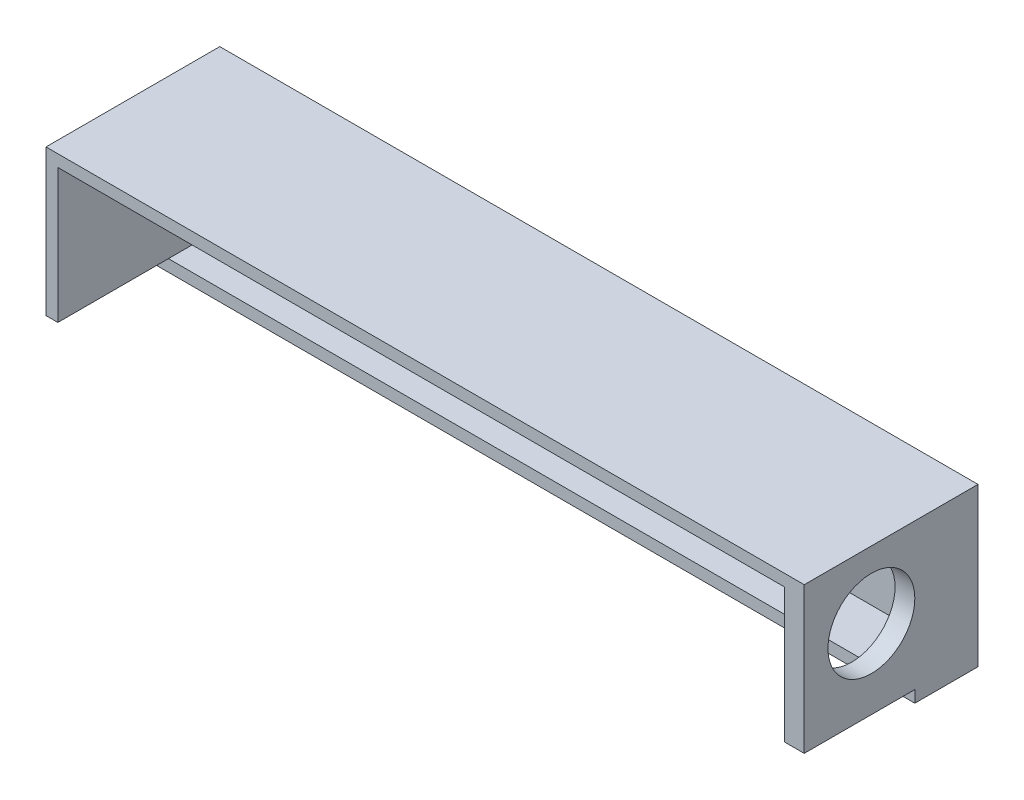
ISO-10303-21;
HEADER;
FILE_DESCRIPTION(('STEP AP214'),'2;1');
FILE_NAME('part.step','',(''),(''),'','','');
FILE_SCHEMA(('AUTOMOTIVE_DESIGN { 1 0 10303 214 1 1 1 1 }'));
ENDSEC;
DATA;
#1=APPLICATION_CONTEXT('core data for automotive mechanical design processes');
#2=APPLICATION_PROTOCOL_DEFINITION('international standard','automotive_design',2000,#1);
#3=PRODUCT_CONTEXT('',#1,'mechanical');
#4=PRODUCT('Part','Part','',(#3));
#5=PRODUCT_RELATED_PRODUCT_CATEGORY('part','',(#4));
#6=PRODUCT_DEFINITION_FORMATION('','',#4);
#7=PRODUCT_DEFINITION_CONTEXT('part definition',#1,'design');
#8=PRODUCT_DEFINITION('design','',#6,#7);
#9=PRODUCT_DEFINITION_SHAPE('','',#8);
#10=(LENGTH_UNIT() NAMED_UNIT(*) SI_UNIT(.MILLI.,.METRE.));
#11=(NAMED_UNIT(*) PLANE_ANGLE_UNIT() SI_UNIT($,.RADIAN.));
#12=(NAMED_UNIT(*) SI_UNIT($,.STERADIAN.) SOLID_ANGLE_UNIT());
#13=UNCERTAINTY_MEASURE_WITH_UNIT(LENGTH_MEASURE(1.E-05),#10,'distance_accuracy_value','');
#14=(GEOMETRIC_REPRESENTATION_CONTEXT(3) GLOBAL_UNCERTAINTY_ASSIGNED_CONTEXT((#13)) GLOBAL_UNIT_ASSIGNED_CONTEXT((#10,
#11,#12)) REPRESENTATION_CONTEXT('',''));
#15=CARTESIAN_POINT('',(0.,0.,0.));
#16=DIRECTION('',(0.,0.,1.));
#17=DIRECTION('',(1.,0.,0.));
#18=AXIS2_PLACEMENT_3D('',#15,#16,#17);
#19=CARTESIAN_POINT('',(46.5,-9.99999999999999,1.5));
#20=DIRECTION('',(0.,1.,0.));
#21=DIRECTION('',(-1.,0.,0.));
#22=AXIS2_PLACEMENT_3D('',#19,#20,#21);
#23=PLANE('',#22);
#24=DIRECTION('',(1.,0.,0.));
#25=VECTOR('',#24,1.);
#26=CARTESIAN_POINT('',(-55.,-9.99999999999999,8.));
#27=LINE('',#26,#25);
#28=CARTESIAN_POINT('',(-49.5,-9.99999999999999,8.));
#29=VERTEX_POINT('',#28);
#30=CARTESIAN_POINT('',(46.5,-9.99999999999999,8.));
#31=VERTEX_POINT('',#30);
#32=EDGE_CURVE('E130',#29,#31,#27,.T.);
#33=ORIENTED_EDGE('',*,*,#32,.F.);
#34=DIRECTION('',(0.,0.,1.));
#35=VECTOR('',#34,1.);
#36=CARTESIAN_POINT('',(-49.5,-9.99999999999999,8.));
#37=LINE('',#36,#35);
#38=CARTESIAN_POINT('',(-49.5,-9.99999999999999,0.));
#39=VERTEX_POINT('',#38);
#40=EDGE_CURVE('E148',#39,#29,#37,.T.);
#41=ORIENTED_EDGE('',*,*,#40,.F.);
#42=DIRECTION('',(1.,0.,0.));
#43=VECTOR('',#42,1.);
#44=CARTESIAN_POINT('',(46.5,-9.99999999999999,0.));
#45=LINE('',#44,#43);
#46=CARTESIAN_POINT('',(46.5,-9.99999999999999,0.));
#47=VERTEX_POINT('',#46);
#48=EDGE_CURVE('E192',#39,#47,#45,.T.);
#49=ORIENTED_EDGE('',*,*,#48,.T.);
#50=DIRECTION('',(0.,0.,-1.));
#51=VECTOR('',#50,1.);
#52=CARTESIAN_POINT('',(46.5,-9.99999999999999,1.5));
#53=LINE('',#52,#51);
#54=EDGE_CURVE('E202',#31,#47,#53,.T.);
#55=ORIENTED_EDGE('',*,*,#54,.F.);
#56=EDGE_LOOP('',(#33,#41,#49,#55));
#57=FACE_BOUND('',#56,.T.);
#58=ADVANCED_FACE('F37',(#57),#23,.F.);
#59=CARTESIAN_POINT('',(46.5,-9.99999999999999,1.5));
#60=DIRECTION('',(-1.,0.,0.));
#61=DIRECTION('',(0.,0.,1.));
#62=AXIS2_PLACEMENT_3D('',#59,#60,#61);
#63=PLANE('',#62);
#64=CARTESIAN_POINT('',(46.5,1.5,13.5));
#65=DIRECTION('',(1.,0.,0.));
#66=DIRECTION('',(0.,0.,-1.));
#67=AXIS2_PLACEMENT_3D('',#64,#65,#66);
#68=CIRCLE('',#67,5.5);
#69=CARTESIAN_POINT('',(46.5,1.5,8.));
#70=VERTEX_POINT('',#69);
#71=EDGE_CURVE('E163',#70,#70,#68,.T.);
#72=ORIENTED_EDGE('',*,*,#71,.F.);
#73=EDGE_LOOP('',(#72));
#74=FACE_BOUND('',#73,.T.);
#75=DIRECTION('',(0.,-1.,0.));
#76=VECTOR('',#75,1.);
#77=CARTESIAN_POINT('',(46.5,0.,8.));
#78=LINE('',#77,#76);
#79=CARTESIAN_POINT('',(46.5,-8.49999999999999,8.));
#80=VERTEX_POINT('',#79);
#81=EDGE_CURVE('E167',#80,#31,#78,.T.);
#82=ORIENTED_EDGE('',*,*,#81,.T.);
#83=ORIENTED_EDGE('',*,*,#54,.T.);
#84=DIRECTION('',(0.,1.,0.));
#85=VECTOR('',#84,1.);
#86=CARTESIAN_POINT('',(46.5,-9.99999999999999,0.));
#87=LINE('',#86,#85);
#88=CARTESIAN_POINT('',(46.5,10.,0.));
#89=VERTEX_POINT('',#88);
#90=EDGE_CURVE('E195',#47,#89,#87,.T.);
#91=ORIENTED_EDGE('',*,*,#90,.T.);
#92=DIRECTION('',(0.,0.,-1.));
#93=VECTOR('',#92,1.);
#94=CARTESIAN_POINT('',(46.5,10.,1.5));
#95=LINE('',#94,#93);
#96=CARTESIAN_POINT('',(46.5,10.,22.));
#97=VERTEX_POINT('',#96);
#98=EDGE_CURVE('E199',#97,#89,#95,.T.);
#99=ORIENTED_EDGE('',*,*,#98,.F.);
#100=DIRECTION('',(0.,1.,0.));
#101=VECTOR('',#100,1.);
#102=CARTESIAN_POINT('',(46.5,0.,22.));
#103=LINE('',#102,#101);
#104=CARTESIAN_POINT('',(46.5,-8.49999999999999,22.));
#105=VERTEX_POINT('',#104);
#106=EDGE_CURVE('E178',#105,#97,#103,.T.);
#107=ORIENTED_EDGE('',*,*,#106,.F.);
#108=DIRECTION('',(0.,0.,-1.));
#109=VECTOR('',#108,1.);
#110=CARTESIAN_POINT('',(46.5,-8.49999999999999,0.));
#111=LINE('',#110,#109);
#112=EDGE_CURVE('E58',#105,#80,#111,.T.);
#113=ORIENTED_EDGE('',*,*,#112,.T.);
#114=EDGE_LOOP('',(#82,#83,#91,#99,#107,#113));
#115=FACE_BOUND('',#114,.T.);
#116=ADVANCED_FACE('F226',(#74,#115),#63,.F.);
#117=CARTESIAN_POINT('',(0.,-8.49999999999999,22.));
#118=DIRECTION('',(0.,-1.,0.));
#119=DIRECTION('',(0.,0.,-1.));
#120=AXIS2_PLACEMENT_3D('',#117,#118,#119);
#121=PLANE('',#120);
#122=DIRECTION('',(1.,0.,0.));
#123=VECTOR('',#122,1.);
#124=CARTESIAN_POINT('',(-55.,-8.49999999999999,8.));
#125=LINE('',#124,#123);
#126=CARTESIAN_POINT('',(-48.,-8.49999999999999,8.));
#127=VERTEX_POINT('',#126);
#128=CARTESIAN_POINT('',(44.,-8.49999999999999,8.));
#129=VERTEX_POINT('',#128);
#130=EDGE_CURVE('E175',#127,#129,#125,.T.);
#131=ORIENTED_EDGE('',*,*,#130,.T.);
#132=DIRECTION('',(0.,0.,-1.));
#133=VECTOR('',#132,1.);
#134=CARTESIAN_POINT('',(44.,-8.49999999999999,22.));
#135=LINE('',#134,#133);
#136=CARTESIAN_POINT('',(44.,-8.49999999999999,1.5));
#137=VERTEX_POINT('',#136);
#138=EDGE_CURVE('E184',#129,#137,#135,.T.);
#139=ORIENTED_EDGE('',*,*,#138,.T.);
#140=DIRECTION('',(-1.,0.,0.));
#141=VECTOR('',#140,1.);
#142=CARTESIAN_POINT('',(0.,-8.49999999999999,1.5));
#143=LINE('',#142,#141);
#144=CARTESIAN_POINT('',(-48.,-8.49999999999999,1.5));
#145=VERTEX_POINT('',#144);
#146=EDGE_CURVE('E179',#137,#145,#143,.T.);
#147=ORIENTED_EDGE('',*,*,#146,.T.);
#148=DIRECTION('',(0.,0.,1.));
#149=VECTOR('',#148,1.);
#150=CARTESIAN_POINT('',(-48.,-8.49999999999999,1.5));
#151=LINE('',#150,#149);
#152=EDGE_CURVE('E136',#145,#127,#151,.T.);
#153=ORIENTED_EDGE('',*,*,#152,.T.);
#154=EDGE_LOOP('',(#131,#139,#147,#153));
#155=FACE_BOUND('',#154,.T.);
#156=ADVANCED_FACE('F231',(#155),#121,.F.);
#157=CARTESIAN_POINT('',(0.,0.,22.));
#158=DIRECTION('',(0.,0.,1.));
#159=DIRECTION('',(1.,0.,0.));
#160=AXIS2_PLACEMENT_3D('',#157,#158,#159);
#161=PLANE('',#160);
#162=DIRECTION('',(0.,-1.,0.));
#163=VECTOR('',#162,1.);
#164=CARTESIAN_POINT('',(-48.,-8.49999999999999,22.));
#165=LINE('',#164,#163);
#166=CARTESIAN_POINT('',(-48.,8.49999999999999,22.));
#167=VERTEX_POINT('',#166);
#168=CARTESIAN_POINT('',(-48.,-8.49999999999999,22.));
#169=VERTEX_POINT('',#168);
#170=EDGE_CURVE('E50',#167,#169,#165,.T.);
#171=ORIENTED_EDGE('',*,*,#170,.F.);
#172=DIRECTION('',(-1.,0.,0.));
#173=VECTOR('',#172,1.);
#174=CARTESIAN_POINT('',(0.,8.49999999999999,22.));
#175=LINE('',#174,#173);
#176=CARTESIAN_POINT('',(44.,8.49999999999999,22.));
#177=VERTEX_POINT('',#176);
#178=EDGE_CURVE('E135',#177,#167,#175,.T.);
#179=ORIENTED_EDGE('',*,*,#178,.F.);
#180=DIRECTION('',(0.,-1.,0.));
#181=VECTOR('',#180,1.);
#182=CARTESIAN_POINT('',(44.,0.,22.));
#183=LINE('',#182,#181);
#184=CARTESIAN_POINT('',(44.,-8.49999999999999,22.));
#185=VERTEX_POINT('',#184);
#186=EDGE_CURVE('E182',#177,#185,#183,.T.);
#187=ORIENTED_EDGE('',*,*,#186,.T.);
#188=DIRECTION('',(1.,0.,0.));
#189=VECTOR('',#188,1.);
#190=CARTESIAN_POINT('',(0.,-8.49999999999999,22.));
#191=LINE('',#190,#189);
#192=EDGE_CURVE('E204',#185,#105,#191,.T.);
#193=ORIENTED_EDGE('',*,*,#192,.T.);
#194=ORIENTED_EDGE('',*,*,#106,.T.);
#195=DIRECTION('',(-1.,0.,0.));
#196=VECTOR('',#195,1.);
#197=CARTESIAN_POINT('',(0.,10.,22.));
#198=LINE('',#197,#196);
#199=CARTESIAN_POINT('',(-49.5,9.99999999999999,22.));
#200=VERTEX_POINT('',#199);
#201=EDGE_CURVE('E176',#97,#200,#198,.T.);
#202=ORIENTED_EDGE('',*,*,#201,.T.);
#203=DIRECTION('',(0.,1.,0.));
#204=VECTOR('',#203,1.);
#205=CARTESIAN_POINT('',(-49.5,9.99999999999999,22.));
#206=LINE('',#205,#204);
#207=CARTESIAN_POINT('',(-49.5,-8.49999999999999,22.));
#208=VERTEX_POINT('',#207);
#209=EDGE_CURVE('E157',#208,#200,#206,.T.);
#210=ORIENTED_EDGE('',*,*,#209,.F.);
#211=EDGE_CURVE('E44',#208,#169,#191,.T.);
#212=ORIENTED_EDGE('',*,*,#211,.T.);
#213=EDGE_LOOP('',(#171,#179,#187,#193,#194,#202,#210,#212));
#214=FACE_BOUND('',#213,.T.);
#215=ADVANCED_FACE('F250',(#214),#161,.T.);
#216=CARTESIAN_POINT('',(46.5,10.,1.5));
#217=DIRECTION('',(0.,-1.,0.));
#218=DIRECTION('',(1.,0.,0.));
#219=AXIS2_PLACEMENT_3D('',#216,#217,#218);
#220=PLANE('',#219);
#221=DIRECTION('',(-1.,0.,0.));
#222=VECTOR('',#221,1.);
#223=CARTESIAN_POINT('',(46.5,10.,0.));
#224=LINE('',#223,#222);
#225=CARTESIAN_POINT('',(-49.5,9.99999999999999,0.));
#226=VERTEX_POINT('',#225);
#227=EDGE_CURVE('E197',#89,#226,#224,.T.);
#228=ORIENTED_EDGE('',*,*,#227,.T.);
#229=DIRECTION('',(0.,0.,-1.));
#230=VECTOR('',#229,1.);
#231=CARTESIAN_POINT('',(-49.5,9.99999999999999,0.));
#232=LINE('',#231,#230);
#233=EDGE_CURVE('E160',#200,#226,#232,.T.);
#234=ORIENTED_EDGE('',*,*,#233,.F.);
#235=ORIENTED_EDGE('',*,*,#201,.F.);
#236=ORIENTED_EDGE('',*,*,#98,.T.);
#237=EDGE_LOOP('',(#228,#234,#235,#236));
#238=FACE_BOUND('',#237,.T.);
#239=ADVANCED_FACE('F256',(#238),#220,.F.);
#240=CARTESIAN_POINT('',(0.,0.,0.));
#241=DIRECTION('',(0.,0.,1.));
#242=DIRECTION('',(1.,0.,0.));
#243=AXIS2_PLACEMENT_3D('',#240,#241,#242);
#244=PLANE('',#243);
#245=ORIENTED_EDGE('',*,*,#48,.F.);
#246=DIRECTION('',(0.,-1.,0.));
#247=VECTOR('',#246,1.);
#248=CARTESIAN_POINT('',(-49.5,9.99999999999999,0.));
#249=LINE('',#248,#247);
#250=EDGE_CURVE('E144',#226,#39,#249,.T.);
#251=ORIENTED_EDGE('',*,*,#250,.F.);
#252=ORIENTED_EDGE('',*,*,#227,.F.);
#253=ORIENTED_EDGE('',*,*,#90,.F.);
#254=EDGE_LOOP('',(#245,#251,#252,#253));
#255=FACE_BOUND('',#254,.T.);
#256=ADVANCED_FACE('F261',(#255),#244,.F.);
#257=CARTESIAN_POINT('',(0.,8.49999999999999,22.));
#258=DIRECTION('',(0.,-1.,0.));
#259=DIRECTION('',(1.,0.,0.));
#260=AXIS2_PLACEMENT_3D('',#257,#258,#259);
#261=PLANE('',#260);
#262=DIRECTION('',(-1.,0.,0.));
#263=VECTOR('',#262,1.);
#264=CARTESIAN_POINT('',(0.,8.49999999999999,1.5));
#265=LINE('',#264,#263);
#266=CARTESIAN_POINT('',(44.,8.49999999999999,1.5));
#267=VERTEX_POINT('',#266);
#268=CARTESIAN_POINT('',(-48.,8.49999999999999,1.5));
#269=VERTEX_POINT('',#268);
#270=EDGE_CURVE('E121',#267,#269,#265,.T.);
#271=ORIENTED_EDGE('',*,*,#270,.F.);
#272=DIRECTION('',(0.,0.,-1.));
#273=VECTOR('',#272,1.);
#274=CARTESIAN_POINT('',(44.,8.49999999999999,22.));
#275=LINE('',#274,#273);
#276=EDGE_CURVE('E190',#177,#267,#275,.T.);
#277=ORIENTED_EDGE('',*,*,#276,.F.);
#278=ORIENTED_EDGE('',*,*,#178,.T.);
#279=DIRECTION('',(0.,0.,1.));
#280=VECTOR('',#279,1.);
#281=CARTESIAN_POINT('',(-48.,8.49999999999999,1.5));
#282=LINE('',#281,#280);
#283=EDGE_CURVE('E132',#269,#167,#282,.T.);
#284=ORIENTED_EDGE('',*,*,#283,.F.);
#285=EDGE_LOOP('',(#271,#277,#278,#284));
#286=FACE_BOUND('',#285,.T.);
#287=ADVANCED_FACE('F133',(#286),#261,.T.);
#288=CARTESIAN_POINT('',(44.,0.,22.));
#289=DIRECTION('',(1.,0.,0.));
#290=DIRECTION('',(0.,0.,-1.));
#291=AXIS2_PLACEMENT_3D('',#288,#289,#290);
#292=PLANE('',#291);
#293=CARTESIAN_POINT('',(44.,1.5,13.5));
#294=DIRECTION('',(1.,0.,0.));
#295=DIRECTION('',(0.,0.,-1.));
#296=AXIS2_PLACEMENT_3D('',#293,#294,#295);
#297=CIRCLE('',#296,5.5);
#298=CARTESIAN_POINT('',(44.,1.5,8.));
#299=VERTEX_POINT('',#298);
#300=EDGE_CURVE('E166',#299,#299,#297,.T.);
#301=ORIENTED_EDGE('',*,*,#300,.T.);
#302=EDGE_LOOP('',(#301));
#303=FACE_BOUND('',#302,.T.);
#304=DIRECTION('',(0.,-1.,0.));
#305=VECTOR('',#304,1.);
#306=CARTESIAN_POINT('',(44.,0.,1.5));
#307=LINE('',#306,#305);
#308=EDGE_CURVE('E128',#267,#137,#307,.T.);
#309=ORIENTED_EDGE('',*,*,#308,.T.);
#310=ORIENTED_EDGE('',*,*,#138,.F.);
#311=EDGE_CURVE('E188',#185,#129,#135,.T.);
#312=ORIENTED_EDGE('',*,*,#311,.F.);
#313=ORIENTED_EDGE('',*,*,#186,.F.);
#314=ORIENTED_EDGE('',*,*,#276,.T.);
#315=EDGE_LOOP('',(#309,#310,#312,#313,#314));
#316=FACE_BOUND('',#315,.T.);
#317=ADVANCED_FACE('F208',(#303,#316),#292,.F.);
#318=CARTESIAN_POINT('',(0.,0.,1.5));
#319=DIRECTION('',(0.,0.,1.));
#320=DIRECTION('',(1.,0.,0.));
#321=AXIS2_PLACEMENT_3D('',#318,#319,#320);
#322=PLANE('',#321);
#323=ORIENTED_EDGE('',*,*,#270,.T.);
#324=DIRECTION('',(0.,-1.,0.));
#325=VECTOR('',#324,1.);
#326=CARTESIAN_POINT('',(-48.,-8.49999999999999,1.5));
#327=LINE('',#326,#325);
#328=EDGE_CURVE('E126',#269,#145,#327,.T.);
#329=ORIENTED_EDGE('',*,*,#328,.T.);
#330=ORIENTED_EDGE('',*,*,#146,.F.);
#331=ORIENTED_EDGE('',*,*,#308,.F.);
#332=EDGE_LOOP('',(#323,#329,#330,#331));
#333=FACE_BOUND('',#332,.T.);
#334=ADVANCED_FACE('F123',(#333),#322,.T.);
#335=CARTESIAN_POINT('',(-55.,0.,8.));
#336=DIRECTION('',(0.,0.,1.));
#337=DIRECTION('',(1.,0.,0.));
#338=AXIS2_PLACEMENT_3D('',#335,#336,#337);
#339=PLANE('',#338);
#340=CARTESIAN_POINT('',(-49.5,-8.49999999999999,8.));
#341=VERTEX_POINT('',#340);
#342=EDGE_CURVE('E173',#341,#127,#125,.T.);
#343=ORIENTED_EDGE('',*,*,#342,.F.);
#344=DIRECTION('',(0.,1.,0.));
#345=VECTOR('',#344,1.);
#346=CARTESIAN_POINT('',(-49.5,-9.99999999999999,8.));
#347=LINE('',#346,#345);
#348=EDGE_CURVE('E151',#29,#341,#347,.T.);
#349=ORIENTED_EDGE('',*,*,#348,.F.);
#350=ORIENTED_EDGE('',*,*,#32,.T.);
#351=ORIENTED_EDGE('',*,*,#81,.F.);
#352=EDGE_CURVE('E171',#129,#80,#125,.T.);
#353=ORIENTED_EDGE('',*,*,#352,.F.);
#354=ORIENTED_EDGE('',*,*,#130,.F.);
#355=EDGE_LOOP('',(#343,#349,#350,#351,#353,#354));
#356=FACE_BOUND('',#355,.T.);
#357=ADVANCED_FACE('F240',(#356),#339,.T.);
#358=CARTESIAN_POINT('',(-55.,-8.49999999999999,0.));
#359=DIRECTION('',(0.,-1.,0.));
#360=DIRECTION('',(0.,0.,-1.));
#361=AXIS2_PLACEMENT_3D('',#358,#359,#360);
#362=PLANE('',#361);
#363=DIRECTION('',(0.,0.,-1.));
#364=VECTOR('',#363,1.);
#365=CARTESIAN_POINT('',(-48.,-8.49999999999999,0.));
#366=LINE('',#365,#364);
#367=EDGE_CURVE('E11',#169,#127,#366,.T.);
#368=ORIENTED_EDGE('',*,*,#367,.F.);
#369=ORIENTED_EDGE('',*,*,#211,.F.);
#370=DIRECTION('',(0.,0.,1.));
#371=VECTOR('',#370,1.);
#372=CARTESIAN_POINT('',(-49.5,-8.49999999999999,8.));
#373=LINE('',#372,#371);
#374=EDGE_CURVE('E154',#341,#208,#373,.T.);
#375=ORIENTED_EDGE('',*,*,#374,.F.);
#376=ORIENTED_EDGE('',*,*,#342,.T.);
#377=EDGE_LOOP('',(#368,#369,#375,#376));
#378=FACE_BOUND('',#377,.T.);
#379=ADVANCED_FACE('F223',(#378),#362,.T.);
#380=ORIENTED_EDGE('',*,*,#311,.T.);
#381=ORIENTED_EDGE('',*,*,#352,.T.);
#382=ORIENTED_EDGE('',*,*,#112,.F.);
#383=ORIENTED_EDGE('',*,*,#192,.F.);
#384=EDGE_LOOP('',(#380,#381,#382,#383));
#385=FACE_BOUND('',#384,.T.);
#386=ADVANCED_FACE('F214',(#385),#362,.T.);
#387=CARTESIAN_POINT('',(43.5,1.5,13.5));
#388=DIRECTION('',(1.,0.,0.));
#389=DIRECTION('',(0.,0.,-1.));
#390=AXIS2_PLACEMENT_3D('',#387,#388,#389);
#391=CYLINDRICAL_SURFACE('',#390,5.5);
#392=ORIENTED_EDGE('',*,*,#71,.T.);
#393=EDGE_LOOP('',(#392));
#394=FACE_BOUND('',#393,.T.);
#395=ORIENTED_EDGE('',*,*,#300,.F.);
#396=EDGE_LOOP('',(#395));
#397=FACE_BOUND('',#396,.T.);
#398=ADVANCED_FACE('F211',(#394,#397),#391,.F.);
#399=CARTESIAN_POINT('',(-49.5,0.,0.));
#400=DIRECTION('',(1.,0.,0.));
#401=DIRECTION('',(0.,0.,-1.));
#402=AXIS2_PLACEMENT_3D('',#399,#400,#401);
#403=PLANE('',#402);
#404=ORIENTED_EDGE('',*,*,#250,.T.);
#405=ORIENTED_EDGE('',*,*,#40,.T.);
#406=ORIENTED_EDGE('',*,*,#348,.T.);
#407=ORIENTED_EDGE('',*,*,#374,.T.);
#408=ORIENTED_EDGE('',*,*,#209,.T.);
#409=ORIENTED_EDGE('',*,*,#233,.T.);
#410=EDGE_LOOP('',(#404,#405,#406,#407,#408,#409));
#411=FACE_BOUND('',#410,.T.);
#412=ADVANCED_FACE('F213',(#411),#403,.F.);
#413=CARTESIAN_POINT('',(-48.,-8.49999999999999,1.5));
#414=DIRECTION('',(-1.,0.,0.));
#415=DIRECTION('',(0.,0.,1.));
#416=AXIS2_PLACEMENT_3D('',#413,#414,#415);
#417=PLANE('',#416);
#418=ORIENTED_EDGE('',*,*,#170,.T.);
#419=ORIENTED_EDGE('',*,*,#367,.T.);
#420=ORIENTED_EDGE('',*,*,#152,.F.);
#421=ORIENTED_EDGE('',*,*,#328,.F.);
#422=ORIENTED_EDGE('',*,*,#283,.T.);
#423=EDGE_LOOP('',(#418,#419,#420,#421,#422));
#424=FACE_BOUND('',#423,.T.);
#425=ADVANCED_FACE('F139',(#424),#417,.F.);
#426=CLOSED_SHELL('',(#58,#116,#156,#215,#239,#256,#287,#317,#334,#357,#379,#386,#398,#412,#425));
#427=MANIFOLD_SOLID_BREP('B2',#426);
#428=ADVANCED_BREP_SHAPE_REPRESENTATION('',(#18,#427),#14);
#429=SHAPE_DEFINITION_REPRESENTATION(#9,#428);
ENDSEC;
END-ISO-10303-21;
